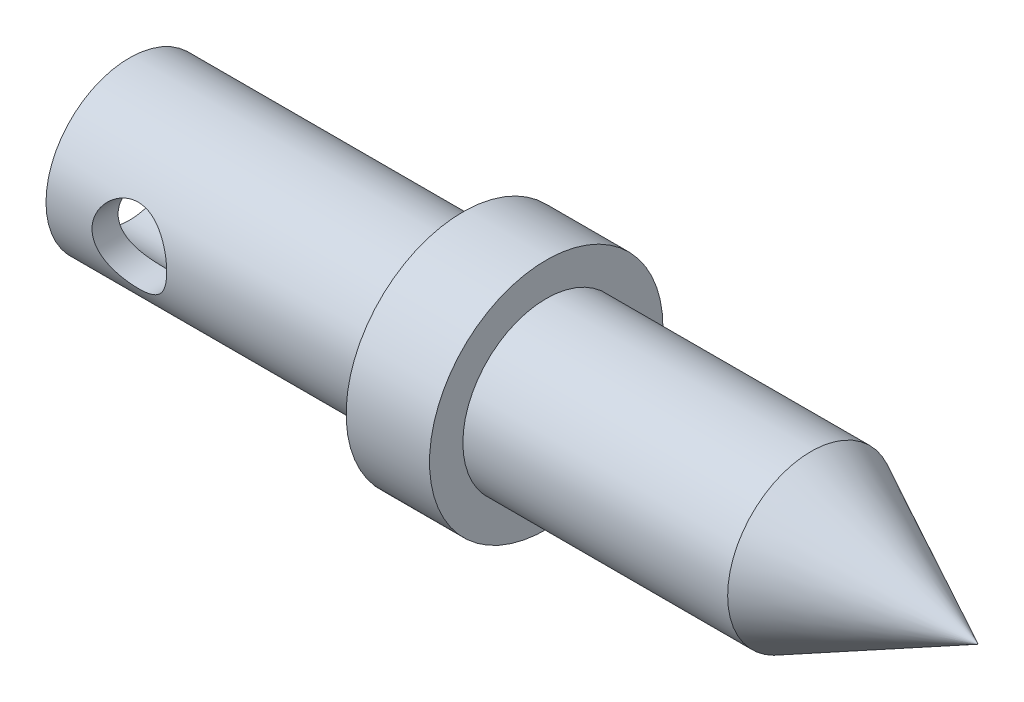
ISO-10303-21;
HEADER;
FILE_DESCRIPTION(('STEP AP214'),'2;1');
FILE_NAME('part.step','',(''),(''),'','','');
FILE_SCHEMA(('AUTOMOTIVE_DESIGN { 1 0 10303 214 1 1 1 1 }'));
ENDSEC;
DATA;
#1=APPLICATION_CONTEXT('core data for automotive mechanical design processes');
#2=APPLICATION_PROTOCOL_DEFINITION('international standard','automotive_design',2000,#1);
#3=PRODUCT_CONTEXT('',#1,'mechanical');
#4=PRODUCT('Part','Part','',(#3));
#5=PRODUCT_RELATED_PRODUCT_CATEGORY('part','',(#4));
#6=PRODUCT_DEFINITION_FORMATION('','',#4);
#7=PRODUCT_DEFINITION_CONTEXT('part definition',#1,'design');
#8=PRODUCT_DEFINITION('design','',#6,#7);
#9=PRODUCT_DEFINITION_SHAPE('','',#8);
#10=(LENGTH_UNIT() NAMED_UNIT(*) SI_UNIT(.MILLI.,.METRE.));
#11=(NAMED_UNIT(*) PLANE_ANGLE_UNIT() SI_UNIT($,.RADIAN.));
#12=(NAMED_UNIT(*) SI_UNIT($,.STERADIAN.) SOLID_ANGLE_UNIT());
#13=UNCERTAINTY_MEASURE_WITH_UNIT(LENGTH_MEASURE(1.E-05),#10,'distance_accuracy_value','');
#14=(GEOMETRIC_REPRESENTATION_CONTEXT(3) GLOBAL_UNCERTAINTY_ASSIGNED_CONTEXT((#13)) GLOBAL_UNIT_ASSIGNED_CONTEXT((#10,
#11,#12)) REPRESENTATION_CONTEXT('',''));
#15=CARTESIAN_POINT('',(0.,0.,0.));
#16=DIRECTION('',(0.,0.,1.));
#17=DIRECTION('',(1.,0.,0.));
#18=AXIS2_PLACEMENT_3D('',#15,#16,#17);
#19=CARTESIAN_POINT('',(-12.7,0.,0.));
#20=DIRECTION('',(1.,0.,0.));
#21=DIRECTION('',(0.,0.,-1.));
#22=AXIS2_PLACEMENT_3D('',#19,#20,#21);
#23=CYLINDRICAL_SURFACE('',#22,3.175);
#24=CARTESIAN_POINT('',(-12.7,0.,0.));
#25=DIRECTION('',(-1.,0.,0.));
#26=DIRECTION('',(0.,0.,1.));
#27=AXIS2_PLACEMENT_3D('',#24,#25,#26);
#28=CIRCLE('',#27,3.175);
#29=CARTESIAN_POINT('',(-12.7,0.,3.175));
#30=VERTEX_POINT('',#29);
#31=EDGE_CURVE('E118',#30,#30,#28,.T.);
#32=ORIENTED_EDGE('',*,*,#31,.F.);
#33=EDGE_LOOP('',(#32));
#34=FACE_BOUND('',#33,.T.);
#35=CARTESIAN_POINT('',(0.,0.,0.));
#36=DIRECTION('',(-1.,0.,0.));
#37=DIRECTION('',(0.,0.,1.));
#38=AXIS2_PLACEMENT_3D('',#35,#36,#37);
#39=CIRCLE('',#38,3.175);
#40=CARTESIAN_POINT('',(0.,0.,3.175));
#41=VERTEX_POINT('',#40);
#42=EDGE_CURVE('E47',#41,#41,#39,.T.);
#43=ORIENTED_EDGE('',*,*,#42,.T.);
#44=EDGE_LOOP('',(#43));
#45=FACE_BOUND('',#44,.T.);
#46=CARTESIAN_POINT('',(-10.9474,0.,3.175));
#47=CARTESIAN_POINT('',(-10.9473963570052,0.0756779264612847,3.17499700537828));
#48=CARTESIAN_POINT('',(-10.9413248337193,0.151472469629567,3.1722640929758));
#49=CARTESIAN_POINT('',(-10.9172809907349,0.300877459493572,3.16160357680319));
#50=CARTESIAN_POINT('',(-10.8992804169438,0.374482286299237,3.15366364060379));
#51=CARTESIAN_POINT('',(-10.8521912902194,0.517110523957208,3.13343126285695));
#52=CARTESIAN_POINT('',(-10.8231425424671,0.586149349369813,3.12115445767676));
#53=CARTESIAN_POINT('',(-10.7549611763161,0.718296366188488,3.09341884806947));
#54=CARTESIAN_POINT('',(-10.715830759152,0.781405848109427,3.07796073839736));
#55=CARTESIAN_POINT('',(-10.6262840432222,0.903560377141486,3.04440800187771));
#56=CARTESIAN_POINT('',(-10.5753908698923,0.962229545257989,3.02621867450654));
#57=CARTESIAN_POINT('',(-10.4647765516525,1.07053229024197,2.98962535005736));
#58=CARTESIAN_POINT('',(-10.4050500993329,1.12016039456472,2.97122123008912));
#59=CARTESIAN_POINT('',(-10.2742160029063,1.211877236786,2.93505583735024));
#60=CARTESIAN_POINT('',(-10.2026452295425,1.25334979523754,2.9173962635315));
#61=CARTESIAN_POINT('',(-10.0526463801713,1.32350083822352,2.88625265757965));
#62=CARTESIAN_POINT('',(-9.97422240083133,1.35218690445795,2.87276615249674));
#63=CARTESIAN_POINT('',(-9.81706083068597,1.39433931178323,2.85253686411667));
#64=CARTESIAN_POINT('',(-9.73856146592803,1.40853356777005,2.84547374055673));
#65=CARTESIAN_POINT('',(-9.58000239115375,1.42356115309051,2.83798818693886));
#66=CARTESIAN_POINT('',(-9.49994378683192,1.42440362819168,2.8375612112241));
#67=CARTESIAN_POINT('',(-9.34835649174536,1.41324598574481,2.84312951691521));
#68=CARTESIAN_POINT('',(-9.27671606519269,1.40241075206483,2.84854231649368));
#69=CARTESIAN_POINT('',(-9.13640452304333,1.37018219603638,2.86418280877391));
#70=CARTESIAN_POINT('',(-9.0677340928652,1.34878645051509,2.87441160651052));
#71=CARTESIAN_POINT('',(-8.93345607032829,1.29562042328715,2.89876883775956));
#72=CARTESIAN_POINT('',(-8.86795256245419,1.26362692528995,2.9129800616056));
#73=CARTESIAN_POINT('',(-8.74296439808899,1.19033457595395,2.94368903851684));
#74=CARTESIAN_POINT('',(-8.68348230879197,1.14903177966538,2.96018775979809));
#75=CARTESIAN_POINT('',(-8.5660168794717,1.05349737532474,2.99559829502278));
#76=CARTESIAN_POINT('',(-8.50876688916211,0.998389913052293,3.01458717295922));
#77=CARTESIAN_POINT('',(-8.40405315685163,0.879201332439006,3.05147836532997));
#78=CARTESIAN_POINT('',(-8.35659246764413,0.815117425223707,3.06938033958896));
#79=CARTESIAN_POINT('',(-8.27149150181106,0.677268375721417,3.10275775647093));
#80=CARTESIAN_POINT('',(-8.23419432850395,0.603267828544155,3.11814269416588));
#81=CARTESIAN_POINT('',(-8.17284362261133,0.449176308692247,3.14403435224135));
#82=CARTESIAN_POINT('',(-8.1487816056215,0.369089275333423,3.15454419712409));
#83=CARTESIAN_POINT('',(-8.11622256160105,0.211186518233031,3.16888947141875));
#84=CARTESIAN_POINT('',(-8.10674419306069,0.133611399260799,3.17314474794642));
#85=CARTESIAN_POINT('',(-8.100640874123,-0.0221332066175229,3.17587664262326));
#86=CARTESIAN_POINT('',(-8.10401146352675,-0.100302477876443,3.17435526599586));
#87=CARTESIAN_POINT('',(-8.12285020383754,-0.250122259019025,3.16596981850281));
#88=CARTESIAN_POINT('',(-8.13758980845343,-0.321884602089044,3.15942761359563));
#89=CARTESIAN_POINT('',(-8.17768887283828,-0.461815818715243,3.14202568319576));
#90=CARTESIAN_POINT('',(-8.20304961590522,-0.529984256917277,3.13116543598407));
#91=CARTESIAN_POINT('',(-8.26447345158172,-0.663206896778449,3.10572476839645));
#92=CARTESIAN_POINT('',(-8.30084531967642,-0.728097940245259,3.09103900076819));
#93=CARTESIAN_POINT('',(-8.38292251076715,-0.851089307777488,3.05946241305371));
#94=CARTESIAN_POINT('',(-8.42863191062324,-0.909186648162121,3.04257063096539));
#95=CARTESIAN_POINT('',(-8.53243792845099,-1.02195133320593,3.00666301846088));
#96=CARTESIAN_POINT('',(-8.59124176781799,-1.0759498889015,2.98758644178358));
#97=CARTESIAN_POINT('',(-8.71730127538655,-1.17354221138499,2.9506191206961));
#98=CARTESIAN_POINT('',(-8.78456008162974,-1.21713209751164,2.93272882035497));
#99=CARTESIAN_POINT('',(-8.92786368837336,-1.29360098054906,2.8998281463255));
#100=CARTESIAN_POINT('',(-9.00408514366298,-1.32618723309754,2.88490028726746));
#101=CARTESIAN_POINT('',(-9.16182136459902,-1.37774800421995,2.86064008788349));
#102=CARTESIAN_POINT('',(-9.24333075269127,-1.39673612189713,2.85130215876789));
#103=CARTESIAN_POINT('',(-9.40181130418259,-1.41911684499667,2.8402242994691));
#104=CARTESIAN_POINT('',(-9.47857292525921,-1.42370629654083,2.83790191548196));
#105=CARTESIAN_POINT('',(-9.63175539314065,-1.4204539548689,2.83953170048166));
#106=CARTESIAN_POINT('',(-9.70817631202577,-1.41261492973785,2.8434824723041));
#107=CARTESIAN_POINT('',(-9.85357360609678,-1.38578112634038,2.85664750427491));
#108=CARTESIAN_POINT('',(-9.92271760613347,-1.36750917841443,2.86551974780031));
#109=CARTESIAN_POINT('',(-10.0569463995941,-1.32109861714779,2.8872090064969));
#110=CARTESIAN_POINT('',(-10.1220300081886,-1.2929571395761,2.90002716667832));
#111=CARTESIAN_POINT('',(-10.2508906630455,-1.22553223953495,2.92918512286425));
#112=CARTESIAN_POINT('',(-10.3143127404411,-1.18564729022863,2.94569872444081));
#113=CARTESIAN_POINT('',(-10.4339350561064,-1.09664135612336,2.97997917208123));
#114=CARTESIAN_POINT('',(-10.4901321998782,-1.04751643581002,2.99774655013484));
#115=CARTESIAN_POINT('',(-10.5989052815985,-0.93623182075846,3.03443938207569));
#116=CARTESIAN_POINT('',(-10.6507074141752,-0.873299154861077,3.05332622848741));
#117=CARTESIAN_POINT('',(-10.7431032888475,-0.738978248416241,3.08858402592099));
#118=CARTESIAN_POINT('',(-10.7836918896988,-0.66758615070313,3.10495382139068));
#119=CARTESIAN_POINT('',(-10.8518563115134,-0.518933230645142,3.13320876014289));
#120=CARTESIAN_POINT('',(-10.8795638783947,-0.441741650534364,3.1451390467364));
#121=CARTESIAN_POINT('',(-10.9213051085478,-0.283245969085183,3.16333883577198));
#122=CARTESIAN_POINT('',(-10.9353803295752,-0.201955166383236,3.16962553818067));
#123=CARTESIAN_POINT('',(-10.944014289794,-0.100124563806049,3.17348471855721));
#124=CARTESIAN_POINT('',(-10.9452827181506,-0.0801273199862786,3.17405194992806));
#125=CARTESIAN_POINT('',(-10.946976061265,-0.0400894460306459,3.17480998975574));
#126=CARTESIAN_POINT('',(-10.9474009651127,-0.0200488153369736,3.17500079334386));
#127=CARTESIAN_POINT('',(-10.9474,0.,3.175));
#128=B_SPLINE_CURVE_WITH_KNOTS('',3,(#46,#47,#48,#49,#50,#51,#52,#53,#54,#55,#56,#57,#58,#59,
#60,#61,#62,#63,#64,#65,#66,#67,#68,#69,#70,#71,#72,#73,#74,#75,#76,#77,#78,#79,#80,#81,#82,#83,
#84,#85,#86,#87,#88,#89,#90,#91,#92,#93,#94,#95,#96,#97,#98,#99,#100,#101,#102,#103,#104,#105,
#106,#107,#108,#109,#110,#111,#112,#113,#114,#115,#116,#117,#118,#119,#120,#121,#122,#123,#124,
#125,#126,#127),.UNSPECIFIED.,.T.,.F.,(4,2,2,2,2,2,2,2,2,2,2,2,2,2,2,2,2,2,2,2,2,2,2,2,2,2,2,2,
2,2,2,2,2,2,2,2,2,2,2,2,4),(0.,0.22695144344719,0.454442354381849,0.681121291506364,
0.907750777369157,1.14603405064644,1.38446108071065,1.63693040208673,1.88924982298657,
2.12815800187746,2.36690252520834,2.58386138104225,2.80087004254674,3.02277571555002,
3.24477560168292,3.48878672324842,3.73287382501105,3.9843946480522,4.23575404505446,
4.46931813848689,4.70280116328764,4.9224515686375,5.14212852088539,5.36864854014991,
5.59526767252509,5.84041499870255,6.08565358087876,6.33697988581587,6.58805449421646,
6.81761671304215,7.04712781068054,7.26238953178569,7.47771377564615,7.70692491324627,
7.9362338990787,8.18605856709384,8.43599758678672,8.6833207421618,8.92988754556653,
8.99001140126522,9.05013603460147),.UNSPECIFIED.);
#129=CARTESIAN_POINT('',(-10.9474,0.,3.175));
#130=VERTEX_POINT('',#129);
#131=EDGE_CURVE('E54',#130,#130,#128,.T.);
#132=ORIENTED_EDGE('',*,*,#131,.T.);
#133=EDGE_LOOP('',(#132));
#134=FACE_BOUND('',#133,.T.);
#135=CARTESIAN_POINT('',(-10.9474,0.,-3.175));
#136=CARTESIAN_POINT('',(-10.9473963570052,0.0756779264612847,-3.17499700537828));
#137=CARTESIAN_POINT('',(-10.9413248337193,0.151472469629567,-3.1722640929758));
#138=CARTESIAN_POINT('',(-10.9172809907349,0.300877459493572,-3.16160357680319));
#139=CARTESIAN_POINT('',(-10.8992804169438,0.374482286299237,-3.15366364060379));
#140=CARTESIAN_POINT('',(-10.8521912902194,0.517110523957208,-3.13343126285695));
#141=CARTESIAN_POINT('',(-10.8231425424671,0.586149349369813,-3.12115445767676));
#142=CARTESIAN_POINT('',(-10.7549611763161,0.718296366188488,-3.09341884806947));
#143=CARTESIAN_POINT('',(-10.715830759152,0.781405848109427,-3.07796073839736));
#144=CARTESIAN_POINT('',(-10.6262840432222,0.903560377141486,-3.04440800187771));
#145=CARTESIAN_POINT('',(-10.5753908698923,0.962229545257989,-3.02621867450654));
#146=CARTESIAN_POINT('',(-10.4647765516525,1.07053229024197,-2.98962535005736));
#147=CARTESIAN_POINT('',(-10.4050500993329,1.12016039456472,-2.97122123008912));
#148=CARTESIAN_POINT('',(-10.2742160029063,1.211877236786,-2.93505583735024));
#149=CARTESIAN_POINT('',(-10.2026452295425,1.25334979523754,-2.9173962635315));
#150=CARTESIAN_POINT('',(-10.0526463801713,1.32350083822352,-2.88625265757965));
#151=CARTESIAN_POINT('',(-9.97422240083133,1.35218690445795,-2.87276615249674));
#152=CARTESIAN_POINT('',(-9.81706083068597,1.39433931178323,-2.85253686411667));
#153=CARTESIAN_POINT('',(-9.73856146592803,1.40853356777005,-2.84547374055673));
#154=CARTESIAN_POINT('',(-9.58000239115375,1.42356115309051,-2.83798818693886));
#155=CARTESIAN_POINT('',(-9.49994378683192,1.42440362819168,-2.8375612112241));
#156=CARTESIAN_POINT('',(-9.34835649174536,1.41324598574481,-2.84312951691521));
#157=CARTESIAN_POINT('',(-9.27671606519269,1.40241075206483,-2.84854231649368));
#158=CARTESIAN_POINT('',(-9.13640452304333,1.37018219603638,-2.86418280877391));
#159=CARTESIAN_POINT('',(-9.0677340928652,1.34878645051509,-2.87441160651052));
#160=CARTESIAN_POINT('',(-8.93345607032829,1.29562042328715,-2.89876883775956));
#161=CARTESIAN_POINT('',(-8.86795256245419,1.26362692528995,-2.9129800616056));
#162=CARTESIAN_POINT('',(-8.74296439808899,1.19033457595395,-2.94368903851684));
#163=CARTESIAN_POINT('',(-8.68348230879197,1.14903177966538,-2.96018775979809));
#164=CARTESIAN_POINT('',(-8.5660168794717,1.05349737532474,-2.99559829502278));
#165=CARTESIAN_POINT('',(-8.50876688916211,0.998389913052293,-3.01458717295922));
#166=CARTESIAN_POINT('',(-8.40405315685163,0.879201332439006,-3.05147836532997));
#167=CARTESIAN_POINT('',(-8.35659246764413,0.815117425223707,-3.06938033958896));
#168=CARTESIAN_POINT('',(-8.27149150181106,0.677268375721417,-3.10275775647093));
#169=CARTESIAN_POINT('',(-8.23419432850395,0.603267828544155,-3.11814269416588));
#170=CARTESIAN_POINT('',(-8.17284362261133,0.449176308692247,-3.14403435224135));
#171=CARTESIAN_POINT('',(-8.1487816056215,0.369089275333423,-3.15454419712409));
#172=CARTESIAN_POINT('',(-8.11622256160105,0.211186518233031,-3.16888947141875));
#173=CARTESIAN_POINT('',(-8.10674419306069,0.133611399260799,-3.17314474794642));
#174=CARTESIAN_POINT('',(-8.100640874123,-0.0221332066175229,-3.17587664262326));
#175=CARTESIAN_POINT('',(-8.10401146352675,-0.100302477876443,-3.17435526599586));
#176=CARTESIAN_POINT('',(-8.12285020383754,-0.250122259019025,-3.16596981850281));
#177=CARTESIAN_POINT('',(-8.13758980845343,-0.321884602089044,-3.15942761359563));
#178=CARTESIAN_POINT('',(-8.17768887283828,-0.461815818715243,-3.14202568319576));
#179=CARTESIAN_POINT('',(-8.20304961590522,-0.529984256917277,-3.13116543598407));
#180=CARTESIAN_POINT('',(-8.26447345158172,-0.663206896778449,-3.10572476839645));
#181=CARTESIAN_POINT('',(-8.30084531967642,-0.728097940245259,-3.09103900076819));
#182=CARTESIAN_POINT('',(-8.38292251076715,-0.851089307777488,-3.05946241305371));
#183=CARTESIAN_POINT('',(-8.42863191062324,-0.909186648162121,-3.04257063096539));
#184=CARTESIAN_POINT('',(-8.53243792845099,-1.02195133320593,-3.00666301846088));
#185=CARTESIAN_POINT('',(-8.59124176781799,-1.0759498889015,-2.98758644178358));
#186=CARTESIAN_POINT('',(-8.71730127538655,-1.17354221138499,-2.9506191206961));
#187=CARTESIAN_POINT('',(-8.78456008162974,-1.21713209751164,-2.93272882035497));
#188=CARTESIAN_POINT('',(-8.92786368837336,-1.29360098054906,-2.8998281463255));
#189=CARTESIAN_POINT('',(-9.00408514366298,-1.32618723309754,-2.88490028726746));
#190=CARTESIAN_POINT('',(-9.16182136459902,-1.37774800421995,-2.86064008788349));
#191=CARTESIAN_POINT('',(-9.24333075269127,-1.39673612189713,-2.85130215876789));
#192=CARTESIAN_POINT('',(-9.40181130418259,-1.41911684499667,-2.8402242994691));
#193=CARTESIAN_POINT('',(-9.47857292525921,-1.42370629654083,-2.83790191548196));
#194=CARTESIAN_POINT('',(-9.63175539314065,-1.4204539548689,-2.83953170048166));
#195=CARTESIAN_POINT('',(-9.70817631202577,-1.41261492973785,-2.8434824723041));
#196=CARTESIAN_POINT('',(-9.85357360609678,-1.38578112634038,-2.85664750427491));
#197=CARTESIAN_POINT('',(-9.92271760613347,-1.36750917841443,-2.86551974780031));
#198=CARTESIAN_POINT('',(-10.0569463995941,-1.32109861714779,-2.8872090064969));
#199=CARTESIAN_POINT('',(-10.1220300081886,-1.2929571395761,-2.90002716667832));
#200=CARTESIAN_POINT('',(-10.2508906630455,-1.22553223953495,-2.92918512286425));
#201=CARTESIAN_POINT('',(-10.3143127404411,-1.18564729022863,-2.94569872444081));
#202=CARTESIAN_POINT('',(-10.4339350561064,-1.09664135612336,-2.97997917208123));
#203=CARTESIAN_POINT('',(-10.4901321998782,-1.04751643581002,-2.99774655013484));
#204=CARTESIAN_POINT('',(-10.5989052815985,-0.93623182075846,-3.03443938207569));
#205=CARTESIAN_POINT('',(-10.6507074141752,-0.873299154861077,-3.05332622848741));
#206=CARTESIAN_POINT('',(-10.7431032888475,-0.738978248416241,-3.08858402592099));
#207=CARTESIAN_POINT('',(-10.7836918896988,-0.66758615070313,-3.10495382139068));
#208=CARTESIAN_POINT('',(-10.8518563115134,-0.518933230645142,-3.13320876014289));
#209=CARTESIAN_POINT('',(-10.8795638783947,-0.441741650534364,-3.1451390467364));
#210=CARTESIAN_POINT('',(-10.9213051085478,-0.283245969085183,-3.16333883577198));
#211=CARTESIAN_POINT('',(-10.9353803295752,-0.201955166383236,-3.16962553818067));
#212=CARTESIAN_POINT('',(-10.944014289794,-0.100124563806049,-3.17348471855721));
#213=CARTESIAN_POINT('',(-10.9452827181506,-0.0801273199862786,-3.17405194992806));
#214=CARTESIAN_POINT('',(-10.946976061265,-0.0400894460306459,-3.17480998975574));
#215=CARTESIAN_POINT('',(-10.9474009651127,-0.0200488153369736,-3.17500079334386));
#216=CARTESIAN_POINT('',(-10.9474,0.,-3.175));
#217=B_SPLINE_CURVE_WITH_KNOTS('',3,(#135,#136,#137,#138,#139,#140,#141,#142,#143,#144,#145,
#146,#147,#148,#149,#150,#151,#152,#153,#154,#155,#156,#157,#158,#159,#160,#161,#162,#163,#164,
#165,#166,#167,#168,#169,#170,#171,#172,#173,#174,#175,#176,#177,#178,#179,#180,#181,#182,#183,
#184,#185,#186,#187,#188,#189,#190,#191,#192,#193,#194,#195,#196,#197,#198,#199,#200,#201,#202,
#203,#204,#205,#206,#207,#208,#209,#210,#211,#212,#213,#214,#215,#216),.UNSPECIFIED.,.T.,.F.,(4,
2,2,2,2,2,2,2,2,2,2,2,2,2,2,2,2,2,2,2,2,2,2,2,2,2,2,2,2,2,2,2,2,2,2,2,2,2,2,2,4),(0.,
0.22695144344719,0.454442354381849,0.681121291506364,0.907750777369157,1.14603405064644,
1.38446108071065,1.63693040208673,1.88924982298657,2.12815800187746,2.36690252520834,
2.58386138104225,2.80087004254674,3.02277571555002,3.24477560168292,3.48878672324842,
3.73287382501105,3.9843946480522,4.23575404505446,4.46931813848689,4.70280116328764,
4.9224515686375,5.14212852088539,5.36864854014991,5.59526767252509,5.84041499870255,
6.08565358087876,6.33697988581587,6.58805449421646,6.81761671304215,7.04712781068054,
7.26238953178569,7.47771377564615,7.70692491324627,7.9362338990787,8.18605856709384,
8.43599758678672,8.6833207421618,8.92988754556653,8.99001140126522,9.05013603460147),.UNSPECIFIED.);
#218=CARTESIAN_POINT('',(-10.9474,0.,-3.175));
#219=VERTEX_POINT('',#218);
#220=EDGE_CURVE('E75',#219,#219,#217,.T.);
#221=ORIENTED_EDGE('',*,*,#220,.F.);
#222=EDGE_LOOP('',(#221));
#223=FACE_BOUND('',#222,.T.);
#224=ADVANCED_FACE('F30',(#34,#45,#134,#223),#23,.T.);
#225=CARTESIAN_POINT('',(-6.35,0.,0.));
#226=DIRECTION('',(-1.,0.,0.));
#227=DIRECTION('',(0.,0.,1.));
#228=AXIS2_PLACEMENT_3D('',#225,#226,#227);
#229=CYLINDRICAL_SURFACE('',#228,2.1828125);
#230=CARTESIAN_POINT('',(-6.35,0.,0.));
#231=DIRECTION('',(-1.,0.,0.));
#232=DIRECTION('',(0.,0.,1.));
#233=AXIS2_PLACEMENT_3D('',#230,#231,#232);
#234=CIRCLE('',#233,2.1828125);
#235=CARTESIAN_POINT('',(-6.35,0.,2.1828125));
#236=VERTEX_POINT('',#235);
#237=EDGE_CURVE('E122',#236,#236,#234,.T.);
#238=ORIENTED_EDGE('',*,*,#237,.F.);
#239=EDGE_LOOP('',(#238));
#240=FACE_BOUND('',#239,.T.);
#241=CARTESIAN_POINT('',(-12.7,0.,0.));
#242=DIRECTION('',(-1.,0.,0.));
#243=DIRECTION('',(0.,0.,1.));
#244=AXIS2_PLACEMENT_3D('',#241,#242,#243);
#245=CIRCLE('',#244,2.1828125);
#246=CARTESIAN_POINT('',(-12.7,0.,2.1828125));
#247=VERTEX_POINT('',#246);
#248=EDGE_CURVE('E129',#247,#247,#245,.T.);
#249=ORIENTED_EDGE('',*,*,#248,.T.);
#250=EDGE_LOOP('',(#249));
#251=FACE_BOUND('',#250,.T.);
#252=CARTESIAN_POINT('',(-10.9474,0.,-2.1828125));
#253=CARTESIAN_POINT('',(-10.9473974295443,-0.0717692520370295,-2.1828100380997));
#254=CARTESIAN_POINT('',(-10.9419363765719,-0.143562476901109,-2.17924026584394));
#255=CARTESIAN_POINT('',(-10.9204155113276,-0.284881118672217,-2.16531008447702));
#256=CARTESIAN_POINT('',(-10.9043471135399,-0.354404650627367,-2.15494417466286));
#257=CARTESIAN_POINT('',(-10.8625792529804,-0.488921047447853,-2.12845207929401));
#258=CARTESIAN_POINT('',(-10.8369252096931,-0.553933590787987,-2.11235307537335));
#259=CARTESIAN_POINT('',(-10.7770615301844,-0.678486402122695,-2.07570406404613));
#260=CARTESIAN_POINT('',(-10.742850994733,-0.738026094057352,-2.05515358885022));
#261=CARTESIAN_POINT('',(-10.6637351481692,-0.855530039218158,-2.00923882679634));
#262=CARTESIAN_POINT('',(-10.6181772009073,-0.912951883630717,-1.98361638531258));
#263=CARTESIAN_POINT('',(-10.5191970516837,-1.01985845094637,-1.9308345181437));
#264=CARTESIAN_POINT('',(-10.4657638949163,-1.06933191359371,-1.90367298443475));
#265=CARTESIAN_POINT('',(-10.3432382603959,-1.16649428143675,-1.84596999393243));
#266=CARTESIAN_POINT('',(-10.2729989913821,-1.21280896446511,-1.81553078823266));
#267=CARTESIAN_POINT('',(-10.1239853154546,-1.29288862427204,-1.75940434614281));
#268=CARTESIAN_POINT('',(-10.0452259450739,-1.32667525884531,-1.73370894791199));
#269=CARTESIAN_POINT('',(-9.90355718380134,-1.3725201171048,-1.69748773260368));
#270=CARTESIAN_POINT('',(-9.84233331192554,-1.3880081953617,-1.68473045882713));
#271=CARTESIAN_POINT('',(-9.71742724034937,-1.41074711007776,-1.66573971113385));
#272=CARTESIAN_POINT('',(-9.65374916287432,-1.41801118567355,-1.65949575325043));
#273=CARTESIAN_POINT('',(-9.52546432436379,-1.42385280678684,-1.65448836138431));
#274=CARTESIAN_POINT('',(-9.46085509844645,-1.42239995899405,-1.65575110087428));
#275=CARTESIAN_POINT('',(-9.33296454355627,-1.41084176641562,-1.66560750023578));
#276=CARTESIAN_POINT('',(-9.2696843734244,-1.40072916769062,-1.67420730606247));
#277=CARTESIAN_POINT('',(-9.14836680599574,-1.37299257767056,-1.69701655095648));
#278=CARTESIAN_POINT('',(-9.09022287867419,-1.3556497792094,-1.71101465409372));
#279=CARTESIAN_POINT('',(-8.97759471932813,-1.31422002522236,-1.74303758589323));
#280=CARTESIAN_POINT('',(-8.92311169838015,-1.29013085139285,-1.76106373864045));
#281=CARTESIAN_POINT('',(-8.80786664929122,-1.23042588051804,-1.80341623335185));
#282=CARTESIAN_POINT('',(-8.74799780237698,-1.19347214271501,-1.82828328959453));
#283=CARTESIAN_POINT('',(-8.63462134040527,-1.11146345960496,-1.87927028852718));
#284=CARTESIAN_POINT('',(-8.58112155970127,-1.06639870485766,-1.90539171989418));
#285=CARTESIAN_POINT('',(-8.47125050947043,-0.959078487431435,-1.96193813724861));
#286=CARTESIAN_POINT('',(-8.41637808453538,-0.895185027147271,-1.99220103618276));
#287=CARTESIAN_POINT('',(-8.31811258770884,-0.757480587331175,-2.04851400416963));
#288=CARTESIAN_POINT('',(-8.27470782099787,-0.683679828126014,-2.07456835451423));
#289=CARTESIAN_POINT('',(-8.20857291315962,-0.543157570807856,-2.11515803305466));
#290=CARTESIAN_POINT('',(-8.1834510513706,-0.477926301285113,-2.13095261884055));
#291=CARTESIAN_POINT('',(-8.14289952201753,-0.343426763539553,-2.15671117436835));
#292=CARTESIAN_POINT('',(-8.12746186343563,-0.274161875416492,-2.16667995086965));
#293=CARTESIAN_POINT('',(-8.10705380689087,-0.133189426074233,-2.17989877325059));
#294=CARTESIAN_POINT('',(-8.10212273366555,-0.0614737051557692,-2.18312357651485));
#295=CARTESIAN_POINT('',(-8.10315024114579,0.0818499692751757,-2.18245387079499));
#296=CARTESIAN_POINT('',(-8.10910892014335,0.15345792180909,-2.17855929755066));
#297=CARTESIAN_POINT('',(-8.13086520273735,0.290004961218909,-2.1644856563707));
#298=CARTESIAN_POINT('',(-8.1460468687975,0.355085623768363,-2.15470033405535));
#299=CARTESIAN_POINT('',(-8.18497021436317,0.48158572096176,-2.13000067102112));
#300=CARTESIAN_POINT('',(-8.20871327936393,0.543004561135412,-2.11508550015447));
#301=CARTESIAN_POINT('',(-8.2657632416637,0.66512881387197,-2.08004422758935));
#302=CARTESIAN_POINT('',(-8.29961539762379,0.725494924428743,-2.05963038780092));
#303=CARTESIAN_POINT('',(-8.37503422622907,0.83994355717666,-2.01567132009163));
#304=CARTESIAN_POINT('',(-8.41660639160372,0.89402156059721,-1.99212386602914));
#305=CARTESIAN_POINT('',(-8.51361813582502,1.00322671715017,-1.93969581119775));
#306=CARTESIAN_POINT('',(-8.57020897158569,1.05720771347519,-1.91055550164618));
#307=CARTESIAN_POINT('',(-8.69165719452866,1.15536193156736,-1.85284950003957));
#308=CARTESIAN_POINT('',(-8.756518164393,1.19953087980744,-1.82428406327035));
#309=CARTESIAN_POINT('',(-8.8858098814544,1.27259999330263,-1.77394884002758));
#310=CARTESIAN_POINT('',(-8.94941389617859,1.30267832452877,-1.75177509209395));
#311=CARTESIAN_POINT('',(-9.08180034703466,1.35343964872393,-1.71286326279226));
#312=CARTESIAN_POINT('',(-9.1505731821722,1.37413958250085,-1.69611539602761));
#313=CARTESIAN_POINT('',(-9.28105470571106,1.40266192812429,-1.67257323187502));
#314=CARTESIAN_POINT('',(-9.34222829922158,1.41197283741786,-1.66464602217927));
#315=CARTESIAN_POINT('',(-9.46575171907034,1.42251360284225,-1.65565038822651));
#316=CARTESIAN_POINT('',(-9.52810056116251,1.42374994386399,-1.65457645994095));
#317=CARTESIAN_POINT('',(-9.65209401989004,1.41806926391707,-1.65944605572049));
#318=CARTESIAN_POINT('',(-9.71373904737883,1.41115727416563,-1.66538524951096));
#319=CARTESIAN_POINT('',(-9.83476694820498,1.3896245520332,-1.68339106252904));
#320=CARTESIAN_POINT('',(-9.89414679038416,1.37499385385793,-1.69546560249246));
#321=CARTESIAN_POINT('',(-10.0262769522325,1.33342984103006,-1.72844521487612));
#322=CARTESIAN_POINT('',(-10.0978999551698,1.30415723966433,-1.75089661451329));
#323=CARTESIAN_POINT('',(-10.2343468962188,1.23527775747726,-1.80015274314515));
#324=CARTESIAN_POINT('',(-10.2991613418301,1.19565671009198,-1.82696342065732));
#325=CARTESIAN_POINT('',(-10.4222948846733,1.10632557111637,-1.88242465915265));
#326=CARTESIAN_POINT('',(-10.4804952117679,1.05646600153221,-1.91109759301869));
#327=CARTESIAN_POINT('',(-10.5884463416022,0.947720128477974,-1.96729377423871));
#328=CARTESIAN_POINT('',(-10.6381950383381,0.888831582073624,-1.99481673375391));
#329=CARTESIAN_POINT('',(-10.7328306487528,0.756097512466841,-2.0490601270892));
#330=CARTESIAN_POINT('',(-10.7766649735405,0.681331843787229,-2.07539559621183));
#331=CARTESIAN_POINT('',(-10.8505050987616,0.523276654254309,-2.12074551140077));
#332=CARTESIAN_POINT('',(-10.8805412092041,0.440006312290492,-2.13977598878461));
#333=CARTESIAN_POINT('',(-10.9173819537545,0.296658219031911,-2.16334347226264));
#334=CARTESIAN_POINT('',(-10.9285958446835,0.238130142112568,-2.17059870041834));
#335=CARTESIAN_POINT('',(-10.9436047190599,0.119739975386419,-2.18033345528749));
#336=CARTESIAN_POINT('',(-10.9474021445758,0.0598783312608948,-2.18281455400611));
#337=CARTESIAN_POINT('',(-10.9474,0.,-2.1828125));
#338=B_SPLINE_CURVE_WITH_KNOTS('',3,(#252,#253,#254,#255,#256,#257,#258,#259,#260,#261,#262,
#263,#264,#265,#266,#267,#268,#269,#270,#271,#272,#273,#274,#275,#276,#277,#278,#279,#280,#281,
#282,#283,#284,#285,#286,#287,#288,#289,#290,#291,#292,#293,#294,#295,#296,#297,#298,#299,#300,
#301,#302,#303,#304,#305,#306,#307,#308,#309,#310,#311,#312,#313,#314,#315,#316,#317,#318,#319,
#320,#321,#322,#323,#324,#325,#326,#327,#328,#329,#330,#331,#332,#333,#334,#335,#336,#337),
.UNSPECIFIED.,.T.,.F.,(4,2,2,2,2,2,2,2,2,2,2,2,2,2,2,2,2,2,2,2,2,2,2,2,2,2,2,2,2,2,2,2,2,2,2,2,
2,2,2,2,2,2,4),(0.,0.215064576703185,0.430303439055015,0.644535111952849,0.858789308630259,
1.09085422856251,1.32324506353269,1.59040196478626,1.85709484266169,2.04959964558451,
2.24179410844437,2.43465908456011,2.62768577443792,2.81381794853726,3.00001139753076,
3.22307689782427,3.4464140081218,3.71360418652251,3.98052082094775,4.19460438903524,
4.40851107073443,4.62321698011313,4.83792482745842,5.03966577930691,5.24143939365228,
5.45708392767296,5.67288248314953,5.92226069548048,6.17174730966109,6.39222751770637,
6.61230785443117,6.7986215506907,6.98478559526725,7.17083475234036,7.35712471157339,
7.59753508413846,7.83827630872455,8.08282021202109,8.32742496243903,8.59761117133197,
8.86720100066889,9.04669221788563,9.22612432287222),.UNSPECIFIED.);
#339=CARTESIAN_POINT('',(-10.9474,0.,-2.1828125));
#340=VERTEX_POINT('',#339);
#341=EDGE_CURVE('E50',#340,#340,#338,.T.);
#342=ORIENTED_EDGE('',*,*,#341,.F.);
#343=EDGE_LOOP('',(#342));
#344=FACE_BOUND('',#343,.T.);
#345=CARTESIAN_POINT('',(-8.1026,0.,2.1828125));
#346=CARTESIAN_POINT('',(-8.10260257045571,-0.0717692520370295,2.1828100380997));
#347=CARTESIAN_POINT('',(-8.10806362342812,-0.143562476901109,2.17924026584394));
#348=CARTESIAN_POINT('',(-8.12958448867242,-0.284881118672217,2.16531008447702));
#349=CARTESIAN_POINT('',(-8.14565288646014,-0.354404650627367,2.15494417466286));
#350=CARTESIAN_POINT('',(-8.18742074701963,-0.488921047447852,2.12845207929401));
#351=CARTESIAN_POINT('',(-8.21307479030689,-0.553933590787986,2.11235307537335));
#352=CARTESIAN_POINT('',(-8.2729384698156,-0.678486402122694,2.07570406404613));
#353=CARTESIAN_POINT('',(-8.30714900526702,-0.738026094057352,2.05515358885022));
#354=CARTESIAN_POINT('',(-8.38626485183077,-0.855530039218158,2.00923882679634));
#355=CARTESIAN_POINT('',(-8.43182279909268,-0.912951883630718,1.98361638531258));
#356=CARTESIAN_POINT('',(-8.53080294831628,-1.01985845094637,1.9308345181437));
#357=CARTESIAN_POINT('',(-8.5842361050837,-1.06933191359371,1.90367298443475));
#358=CARTESIAN_POINT('',(-8.70676173960409,-1.16649428143675,1.84596999393243));
#359=CARTESIAN_POINT('',(-8.77700100861795,-1.21280896446511,1.81553078823266));
#360=CARTESIAN_POINT('',(-8.92601468454538,-1.29288862427204,1.75940434614281));
#361=CARTESIAN_POINT('',(-9.00477405492605,-1.32667525884531,1.73370894791199));
#362=CARTESIAN_POINT('',(-9.14644281619866,-1.3725201171048,1.69748773260368));
#363=CARTESIAN_POINT('',(-9.20766668807446,-1.3880081953617,1.68473045882713));
#364=CARTESIAN_POINT('',(-9.33257275965062,-1.41074711007776,1.66573971113385));
#365=CARTESIAN_POINT('',(-9.39625083712568,-1.41801118567355,1.65949575325043));
#366=CARTESIAN_POINT('',(-9.52453567563621,-1.42385280678684,1.65448836138431));
#367=CARTESIAN_POINT('',(-9.58914490155354,-1.42239995899405,1.65575110087428));
#368=CARTESIAN_POINT('',(-9.71703545644372,-1.41084176641562,1.66560750023578));
#369=CARTESIAN_POINT('',(-9.7803156265756,-1.40072916769062,1.67420730606247));
#370=CARTESIAN_POINT('',(-9.90163319400425,-1.37299257767056,1.69701655095648));
#371=CARTESIAN_POINT('',(-9.95977712132581,-1.3556497792094,1.71101465409372));
#372=CARTESIAN_POINT('',(-10.0724052806719,-1.31422002522236,1.74303758589323));
#373=CARTESIAN_POINT('',(-10.1268883016199,-1.29013085139285,1.76106373864045));
#374=CARTESIAN_POINT('',(-10.2421333507088,-1.23042588051804,1.80341623335185));
#375=CARTESIAN_POINT('',(-10.302002197623,-1.19347214271502,1.82828328959453));
#376=CARTESIAN_POINT('',(-10.4153786595947,-1.11146345960496,1.87927028852718));
#377=CARTESIAN_POINT('',(-10.4688784402987,-1.06639870485766,1.90539171989418));
#378=CARTESIAN_POINT('',(-10.5787494905296,-0.959078487431435,1.96193813724861));
#379=CARTESIAN_POINT('',(-10.6336219154646,-0.895185027147271,1.99220103618276));
#380=CARTESIAN_POINT('',(-10.7318874122912,-0.757480587331175,2.04851400416963));
#381=CARTESIAN_POINT('',(-10.7752921790021,-0.683679828126014,2.07456835451423));
#382=CARTESIAN_POINT('',(-10.8414270868404,-0.543157570807856,2.11515803305466));
#383=CARTESIAN_POINT('',(-10.8665489486294,-0.477926301285113,2.13095261884055));
#384=CARTESIAN_POINT('',(-10.9071004779825,-0.343426763539553,2.15671117436835));
#385=CARTESIAN_POINT('',(-10.9225381365644,-0.274161875416492,2.16667995086965));
#386=CARTESIAN_POINT('',(-10.9429461931091,-0.133189426074233,2.17989877325059));
#387=CARTESIAN_POINT('',(-10.9478772663344,-0.0614737051557692,2.18312357651485));
#388=CARTESIAN_POINT('',(-10.9468497588542,0.0818499692751757,2.18245387079499));
#389=CARTESIAN_POINT('',(-10.9408910798566,0.15345792180909,2.17855929755066));
#390=CARTESIAN_POINT('',(-10.9191347972626,0.290004961218909,2.1644856563707));
#391=CARTESIAN_POINT('',(-10.9039531312025,0.355085623768363,2.15470033405535));
#392=CARTESIAN_POINT('',(-10.8650297856368,0.48158572096176,2.13000067102112));
#393=CARTESIAN_POINT('',(-10.8412867206361,0.543004561135412,2.11508550015447));
#394=CARTESIAN_POINT('',(-10.7842367583363,0.66512881387197,2.08004422758935));
#395=CARTESIAN_POINT('',(-10.7503846023762,0.725494924428743,2.05963038780092));
#396=CARTESIAN_POINT('',(-10.6749657737709,0.83994355717666,2.01567132009163));
#397=CARTESIAN_POINT('',(-10.6333936083963,0.89402156059721,1.99212386602914));
#398=CARTESIAN_POINT('',(-10.536381864175,1.00322671715017,1.93969581119775));
#399=CARTESIAN_POINT('',(-10.4797910284143,1.05720771347519,1.91055550164618));
#400=CARTESIAN_POINT('',(-10.3583428054713,1.15536193156736,1.85284950003957));
#401=CARTESIAN_POINT('',(-10.293481835607,1.19953087980744,1.82428406327035));
#402=CARTESIAN_POINT('',(-10.1641901185456,1.27259999330263,1.77394884002758));
#403=CARTESIAN_POINT('',(-10.1005861038214,1.30267832452877,1.75177509209395));
#404=CARTESIAN_POINT('',(-9.96819965296534,1.35343964872393,1.71286326279226));
#405=CARTESIAN_POINT('',(-9.8994268178278,1.37413958250085,1.69611539602761));
#406=CARTESIAN_POINT('',(-9.76894529428893,1.40266192812429,1.67257323187502));
#407=CARTESIAN_POINT('',(-9.70777170077842,1.41197283741786,1.66464602217927));
#408=CARTESIAN_POINT('',(-9.58424828092966,1.42251360284225,1.65565038822651));
#409=CARTESIAN_POINT('',(-9.52189943883749,1.42374994386399,1.65457645994095));
#410=CARTESIAN_POINT('',(-9.39790598010996,1.41806926391707,1.65944605572049));
#411=CARTESIAN_POINT('',(-9.33626095262117,1.41115727416563,1.66538524951096));
#412=CARTESIAN_POINT('',(-9.21523305179501,1.3896245520332,1.68339106252904));
#413=CARTESIAN_POINT('',(-9.15585320961583,1.37499385385793,1.69546560249246));
#414=CARTESIAN_POINT('',(-9.02372304776749,1.33342984103006,1.72844521487612));
#415=CARTESIAN_POINT('',(-8.95210004483015,1.30415723966433,1.75089661451329));
#416=CARTESIAN_POINT('',(-8.81565310378116,1.23527775747726,1.80015274314515));
#417=CARTESIAN_POINT('',(-8.75083865816987,1.19565671009198,1.82696342065732));
#418=CARTESIAN_POINT('',(-8.62770511532671,1.10632557111637,1.88242465915266));
#419=CARTESIAN_POINT('',(-8.56950478823212,1.05646600153221,1.91109759301869));
#420=CARTESIAN_POINT('',(-8.46155365839783,0.947720128477974,1.96729377423871));
#421=CARTESIAN_POINT('',(-8.4118049616619,0.888831582073624,1.99481673375391));
#422=CARTESIAN_POINT('',(-8.31716935124721,0.756097512466841,2.0490601270892));
#423=CARTESIAN_POINT('',(-8.27333502645953,0.681331843787229,2.07539559621183));
#424=CARTESIAN_POINT('',(-8.19949490123841,0.523276654254309,2.12074551140077));
#425=CARTESIAN_POINT('',(-8.16945879079589,0.440006312290492,2.13977598878461));
#426=CARTESIAN_POINT('',(-8.13261804624554,0.296658219031911,2.16334347226264));
#427=CARTESIAN_POINT('',(-8.1214041553165,0.238130142112568,2.17059870041834));
#428=CARTESIAN_POINT('',(-8.10639528094013,0.119739975386419,2.18033345528749));
#429=CARTESIAN_POINT('',(-8.10259785542424,0.0598783312608948,2.18281455400611));
#430=CARTESIAN_POINT('',(-8.1026,0.,2.1828125));
#431=B_SPLINE_CURVE_WITH_KNOTS('',3,(#345,#346,#347,#348,#349,#350,#351,#352,#353,#354,#355,
#356,#357,#358,#359,#360,#361,#362,#363,#364,#365,#366,#367,#368,#369,#370,#371,#372,#373,#374,
#375,#376,#377,#378,#379,#380,#381,#382,#383,#384,#385,#386,#387,#388,#389,#390,#391,#392,#393,
#394,#395,#396,#397,#398,#399,#400,#401,#402,#403,#404,#405,#406,#407,#408,#409,#410,#411,#412,
#413,#414,#415,#416,#417,#418,#419,#420,#421,#422,#423,#424,#425,#426,#427,#428,#429,#430),
.UNSPECIFIED.,.T.,.F.,(4,2,2,2,2,2,2,2,2,2,2,2,2,2,2,2,2,2,2,2,2,2,2,2,2,2,2,2,2,2,2,2,2,2,2,2,
2,2,2,2,2,2,4),(0.,0.215064576703185,0.430303439055015,0.644535111952848,0.858789308630258,
1.09085422856251,1.32324506353269,1.59040196478626,1.85709484266169,2.04959964558451,
2.24179410844437,2.43465908456011,2.62768577443792,2.81381794853727,3.00001139753076,
3.22307689782427,3.4464140081218,3.71360418652251,3.98052082094775,4.19460438903524,
4.40851107073443,4.62321698011313,4.83792482745842,5.03966577930691,5.24143939365228,
5.45708392767296,5.67288248314953,5.92226069548048,6.17174730966109,6.39222751770637,
6.61230785443117,6.7986215506907,6.98478559526725,7.17083475234036,7.35712471157339,
7.59753508413846,7.83827630872455,8.08282021202109,8.32742496243903,8.59761117133197,
8.86720100066889,9.04669221788563,9.22612432287222),.UNSPECIFIED.);
#432=CARTESIAN_POINT('',(-8.1026,0.,2.1828125));
#433=VERTEX_POINT('',#432);
#434=EDGE_CURVE('E34',#433,#433,#431,.T.);
#435=ORIENTED_EDGE('',*,*,#434,.F.);
#436=EDGE_LOOP('',(#435));
#437=FACE_BOUND('',#436,.T.);
#438=ADVANCED_FACE('F55',(#240,#251,#344,#437),#229,.F.);
#439=CARTESIAN_POINT('',(3.175,0.,0.));
#440=DIRECTION('',(-1.,0.,0.));
#441=DIRECTION('',(0.,0.,1.));
#442=AXIS2_PLACEMENT_3D('',#439,#440,#441);
#443=CYLINDRICAL_SURFACE('',#442,4.445);
#444=CARTESIAN_POINT('',(3.175,0.,0.));
#445=DIRECTION('',(1.,0.,0.));
#446=DIRECTION('',(0.,0.,-1.));
#447=AXIS2_PLACEMENT_3D('',#444,#445,#446);
#448=CIRCLE('',#447,4.445);
#449=CARTESIAN_POINT('',(3.175,0.,-4.445));
#450=VERTEX_POINT('',#449);
#451=EDGE_CURVE('E113',#450,#450,#448,.T.);
#452=ORIENTED_EDGE('',*,*,#451,.F.);
#453=EDGE_LOOP('',(#452));
#454=FACE_BOUND('',#453,.T.);
#455=CARTESIAN_POINT('',(0.,0.,0.));
#456=DIRECTION('',(1.,0.,0.));
#457=DIRECTION('',(0.,0.,-1.));
#458=AXIS2_PLACEMENT_3D('',#455,#456,#457);
#459=CIRCLE('',#458,4.445);
#460=CARTESIAN_POINT('',(0.,0.,-4.445));
#461=VERTEX_POINT('',#460);
#462=EDGE_CURVE('E116',#461,#461,#459,.T.);
#463=ORIENTED_EDGE('',*,*,#462,.T.);
#464=EDGE_LOOP('',(#463));
#465=FACE_BOUND('',#464,.T.);
#466=ADVANCED_FACE('F100',(#454,#465),#443,.T.);
#467=CARTESIAN_POINT('',(3.175,0.,0.));
#468=DIRECTION('',(1.,0.,0.));
#469=DIRECTION('',(0.,0.,-1.));
#470=AXIS2_PLACEMENT_3D('',#467,#468,#469);
#471=PLANE('',#470);
#472=CARTESIAN_POINT('',(3.175,0.,0.));
#473=DIRECTION('',(1.,0.,0.));
#474=DIRECTION('',(0.,0.,-1.));
#475=AXIS2_PLACEMENT_3D('',#472,#473,#474);
#476=CIRCLE('',#475,3.175);
#477=CARTESIAN_POINT('',(3.175,0.,-3.175));
#478=VERTEX_POINT('',#477);
#479=EDGE_CURVE('E119',#478,#478,#476,.T.);
#480=ORIENTED_EDGE('',*,*,#479,.F.);
#481=EDGE_LOOP('',(#480));
#482=FACE_BOUND('',#481,.T.);
#483=ORIENTED_EDGE('',*,*,#451,.T.);
#484=EDGE_LOOP('',(#483));
#485=FACE_BOUND('',#484,.T.);
#486=ADVANCED_FACE('F97',(#482,#485),#471,.T.);
#487=CARTESIAN_POINT('',(0.,0.,0.));
#488=DIRECTION('',(1.,0.,0.));
#489=DIRECTION('',(0.,0.,-1.));
#490=AXIS2_PLACEMENT_3D('',#487,#488,#489);
#491=PLANE('',#490);
#492=ORIENTED_EDGE('',*,*,#42,.F.);
#493=EDGE_LOOP('',(#492));
#494=FACE_BOUND('',#493,.T.);
#495=ORIENTED_EDGE('',*,*,#462,.F.);
#496=EDGE_LOOP('',(#495));
#497=FACE_BOUND('',#496,.T.);
#498=ADVANCED_FACE('F96',(#494,#497),#491,.F.);
#499=CARTESIAN_POINT('',(19.6088,0.,0.));
#500=DIRECTION('',(-1.,0.,0.));
#501=DIRECTION('',(0.,0.,1.));
#502=AXIS2_PLACEMENT_3D('',#499,#500,#501);
#503=CYLINDRICAL_SURFACE('',#502,3.175);
#504=CARTESIAN_POINT('',(13.2588,0.,0.));
#505=DIRECTION('',(1.,0.,0.));
#506=DIRECTION('',(0.,0.,-1.));
#507=AXIS2_PLACEMENT_3D('',#504,#505,#506);
#508=CIRCLE('',#507,3.175);
#509=CARTESIAN_POINT('',(13.2588,0.,3.175));
#510=VERTEX_POINT('',#509);
#511=EDGE_CURVE('E10',#510,#510,#508,.F.);
#512=ORIENTED_EDGE('',*,*,#511,.T.);
#513=EDGE_LOOP('',(#512));
#514=FACE_BOUND('',#513,.T.);
#515=ORIENTED_EDGE('',*,*,#479,.T.);
#516=EDGE_LOOP('',(#515));
#517=FACE_BOUND('',#516,.T.);
#518=ADVANCED_FACE('F92',(#514,#517),#503,.T.);
#519=CARTESIAN_POINT('',(19.6088,0.,0.));
#520=DIRECTION('',(1.,0.,0.));
#521=DIRECTION('',(0.,0.,-1.));
#522=AXIS2_PLACEMENT_3D('',#519,#520,#521);
#523=PLANE('',#522);
#524=CARTESIAN_POINT('',(19.6088,0.,0.));
#525=DIRECTION('',(1.,0.,0.));
#526=DIRECTION('',(0.,0.,-1.));
#527=AXIS2_PLACEMENT_3D('',#524,#525,#526);
#528=CIRCLE('',#527,0.0090067888607083);
#529=CARTESIAN_POINT('',(19.6088,0.,0.00900678886070916));
#530=VERTEX_POINT('',#529);
#531=EDGE_CURVE('E42',#530,#530,#528,.T.);
#532=ORIENTED_EDGE('',*,*,#531,.T.);
#533=EDGE_LOOP('',(#532));
#534=FACE_BOUND('',#533,.T.);
#535=ADVANCED_FACE('F89',(#534),#523,.T.);
#536=CARTESIAN_POINT('',(-12.7,0.,0.));
#537=DIRECTION('',(-1.,0.,0.));
#538=DIRECTION('',(0.,0.,1.));
#539=AXIS2_PLACEMENT_3D('',#536,#537,#538);
#540=PLANE('',#539);
#541=ORIENTED_EDGE('',*,*,#248,.F.);
#542=EDGE_LOOP('',(#541));
#543=FACE_BOUND('',#542,.T.);
#544=ORIENTED_EDGE('',*,*,#31,.T.);
#545=EDGE_LOOP('',(#544));
#546=FACE_BOUND('',#545,.T.);
#547=ADVANCED_FACE('F88',(#543,#546),#540,.T.);
#548=CARTESIAN_POINT('',(19.6088,0.,0.));
#549=DIRECTION('',(-1.,0.,0.));
#550=DIRECTION('',(0.,0.,1.));
#551=AXIS2_PLACEMENT_3D('',#548,#549,#550);
#552=CONICAL_SURFACE('',#551,0.0090067888607083,0.462512251778496);
#553=CARTESIAN_POINT('',(13.2588,0.,3.175));
#554=CARTESIAN_POINT('',(13.3249458333333,0.,3.14202090405063));
#555=CARTESIAN_POINT('',(13.3910916666666,0.,3.10904180810127));
#556=CARTESIAN_POINT('',(13.5233833333333,0.,3.04308361620253));
#557=CARTESIAN_POINT('',(13.5895291666666,0.,3.01010452025316));
#558=CARTESIAN_POINT('',(13.7218208333333,0.,2.94414632835443));
#559=CARTESIAN_POINT('',(13.7879666666666,0.,2.91116723240506));
#560=CARTESIAN_POINT('',(13.9202583333333,0.,2.84520904050633));
#561=CARTESIAN_POINT('',(13.9864041666666,0.,2.81222994455696));
#562=CARTESIAN_POINT('',(14.1186958333333,0.,2.74627175265822));
#563=CARTESIAN_POINT('',(14.1848416666666,0.,2.71329265670885));
#564=CARTESIAN_POINT('',(14.3171333333333,0.,2.64733446481012));
#565=CARTESIAN_POINT('',(14.3832791666666,0.,2.61435536886075));
#566=CARTESIAN_POINT('',(14.5155708333333,0.,2.54839717696202));
#567=CARTESIAN_POINT('',(14.5817166666666,0.,2.51541808101265));
#568=CARTESIAN_POINT('',(14.7140083333333,0.,2.44945988911391));
#569=CARTESIAN_POINT('',(14.7801541666666,0.,2.41648079316455));
#570=CARTESIAN_POINT('',(14.9124458333333,0.,2.35052260126581));
#571=CARTESIAN_POINT('',(14.9785916666666,0.,2.31754350531644));
#572=CARTESIAN_POINT('',(15.1108833333333,0.,2.25158531341771));
#573=CARTESIAN_POINT('',(15.1770291666666,0.,2.21860621746834));
#574=CARTESIAN_POINT('',(15.3093208333333,0.,2.15264802556961));
#575=CARTESIAN_POINT('',(15.3754666666666,0.,2.11966892962024));
#576=CARTESIAN_POINT('',(15.5077583333333,0.,2.0537107377215));
#577=CARTESIAN_POINT('',(15.5739041666666,0.,2.02073164177214));
#578=CARTESIAN_POINT('',(15.7061958333333,0.,1.9547734498734));
#579=CARTESIAN_POINT('',(15.7723416666666,0.,1.92179435392403));
#580=CARTESIAN_POINT('',(15.9046333333333,0.,1.8558361620253));
#581=CARTESIAN_POINT('',(15.9707791666666,0.,1.82285706607593));
#582=CARTESIAN_POINT('',(16.1030708333333,0.,1.75689887417719));
#583=CARTESIAN_POINT('',(16.1692166666666,0.,1.72391977822783));
#584=CARTESIAN_POINT('',(16.3015083333333,0.,1.65796158632909));
#585=CARTESIAN_POINT('',(16.3676541666666,0.,1.62498249037972));
#586=CARTESIAN_POINT('',(16.4999458333333,0.,1.55902429848099));
#587=CARTESIAN_POINT('',(16.5660916666666,0.,1.52604520253162));
#588=CARTESIAN_POINT('',(16.6983833333333,0.,1.46008701063288));
#589=CARTESIAN_POINT('',(16.7645291666666,0.,1.42710791468352));
#590=CARTESIAN_POINT('',(16.8968208333333,0.,1.36114972278478));
#591=CARTESIAN_POINT('',(16.9629666666667,0.,1.32817062683541));
#592=CARTESIAN_POINT('',(17.0952583333333,0.,1.26221243493668));
#593=CARTESIAN_POINT('',(17.1614041666666,0.,1.22923333898731));
#594=CARTESIAN_POINT('',(17.2936958333333,0.,1.16327514708858));
#595=CARTESIAN_POINT('',(17.3598416666667,0.,1.13029605113921));
#596=CARTESIAN_POINT('',(17.4921333333333,0.,1.06433785924047));
#597=CARTESIAN_POINT('',(17.5582791666667,0.,1.03135876329111));
#598=CARTESIAN_POINT('',(17.6905708333333,0.,0.965400571392371));
#599=CARTESIAN_POINT('',(17.7567166666667,0.,0.932421475443003));
#600=CARTESIAN_POINT('',(17.8890083333333,0.,0.866463283544267));
#601=CARTESIAN_POINT('',(17.9551541666667,0.,0.8334841875949));
#602=CARTESIAN_POINT('',(18.0874458333333,0.,0.767525995696165));
#603=CARTESIAN_POINT('',(18.1535916666667,0.,0.734546899746797));
#604=CARTESIAN_POINT('',(18.2858833333333,0.,0.668588707848061));
#605=CARTESIAN_POINT('',(18.3520291666667,0.,0.635609611898694));
#606=CARTESIAN_POINT('',(18.4843208333333,0.,0.569651419999959));
#607=CARTESIAN_POINT('',(18.5504666666667,0.,0.536672324050592));
#608=CARTESIAN_POINT('',(18.6827583333333,0.,0.470714132151856));
#609=CARTESIAN_POINT('',(18.7489041666667,0.,0.437735036202488));
#610=CARTESIAN_POINT('',(18.8811958333333,0.,0.371776844303753));
#611=CARTESIAN_POINT('',(18.9473416666667,0.,0.338797748354386));
#612=CARTESIAN_POINT('',(19.0796333333333,0.,0.27283955645565));
#613=CARTESIAN_POINT('',(19.1457791666667,0.,0.239860460506282));
#614=CARTESIAN_POINT('',(19.2780708333333,0.,0.173902268607547));
#615=CARTESIAN_POINT('',(19.3442166666667,0.,0.140923172658179));
#616=CARTESIAN_POINT('',(19.4765083333333,0.,0.0749649807594443));
#617=CARTESIAN_POINT('',(19.5426541666667,0.,0.0419858848100768));
#618=CARTESIAN_POINT('',(19.6088,0.,0.00900678886070916));
#619=B_SPLINE_CURVE_WITH_KNOTS('',3,(#553,#554,#555,#556,#557,#558,#559,#560,#561,#562,#563,
#564,#565,#566,#567,#568,#569,#570,#571,#572,#573,#574,#575,#576,#577,#578,#579,#580,#581,#582,
#583,#584,#585,#586,#587,#588,#589,#590,#591,#592,#593,#594,#595,#596,#597,#598,#599,#600,#601,
#602,#603,#604,#605,#606,#607,#608,#609,#610,#611,#612,#613,#614,#615,#616,#617,#618),
.UNSPECIFIED.,.F.,.F.,(4,2,2,2,2,2,2,2,2,2,2,2,2,2,2,2,2,2,2,2,2,2,2,2,2,2,2,2,2,2,2,2,4),(0.,
0.221734138853243,0.443468277706485,0.665202416559726,0.88693655541297,1.10867069426621,
1.33040483311945,1.55213897197269,1.77387311082594,1.99560724967918,2.21734138853242,
2.43907552738566,2.6608096662389,2.88254380509215,3.10427794394539,3.32601208279863,
3.54774622165187,3.76948036050511,3.99121449935836,4.2129486382116,4.43468277706484,
4.65641691591808,4.87815105477133,5.09988519362457,5.32161933247781,5.54335347133105,
5.76508761018429,5.98682174903754,6.20855588789078,6.43029002674402,6.65202416559726,
6.8737583044505,7.09549244330375),.UNSPECIFIED.);
#620=EDGE_CURVE('BSEAM32',#510,#530,#619,.T.);
#621=ORIENTED_EDGE('',*,*,#511,.F.);
#622=ORIENTED_EDGE('',*,*,#531,.F.);
#623=ORIENTED_EDGE('',*,*,#620,.T.);
#624=ORIENTED_EDGE('',*,*,#620,.F.);
#625=EDGE_LOOP('',(#621,#623,#622,#624));
#626=FACE_BOUND('',#625,.T.);
#627=ADVANCED_FACE('F32',(#626),#552,.T.);
#628=CARTESIAN_POINT('',(-6.35,0.,0.));
#629=DIRECTION('',(-1.,0.,0.));
#630=DIRECTION('',(0.,0.,1.));
#631=AXIS2_PLACEMENT_3D('',#628,#629,#630);
#632=PLANE('',#631);
#633=CARTESIAN_POINT('',(-6.35,0.,0.));
#634=DIRECTION('',(-1.,0.,0.));
#635=DIRECTION('',(0.,0.,1.));
#636=AXIS2_PLACEMENT_3D('',#633,#634,#635);
#637=CIRCLE('',#636,1.7859375);
#638=CARTESIAN_POINT('',(-6.35,0.,1.7859375));
#639=VERTEX_POINT('',#638);
#640=EDGE_CURVE('E81',#639,#639,#637,.T.);
#641=ORIENTED_EDGE('',*,*,#640,.F.);
#642=EDGE_LOOP('',(#641));
#643=FACE_BOUND('',#642,.T.);
#644=ORIENTED_EDGE('',*,*,#237,.T.);
#645=EDGE_LOOP('',(#644));
#646=FACE_BOUND('',#645,.T.);
#647=ADVANCED_FACE('F142',(#643,#646),#632,.T.);
#648=CARTESIAN_POINT('',(-4.445,0.,0.));
#649=DIRECTION('',(-1.,0.,0.));
#650=DIRECTION('',(0.,0.,1.));
#651=AXIS2_PLACEMENT_3D('',#648,#649,#650);
#652=CYLINDRICAL_SURFACE('',#651,1.7859375);
#653=CARTESIAN_POINT('',(-4.445,0.,0.));
#654=DIRECTION('',(-1.,0.,0.));
#655=DIRECTION('',(0.,0.,1.));
#656=AXIS2_PLACEMENT_3D('',#653,#654,#655);
#657=CIRCLE('',#656,1.7859375);
#658=CARTESIAN_POINT('',(-4.445,0.,1.7859375));
#659=VERTEX_POINT('',#658);
#660=EDGE_CURVE('E82',#659,#659,#657,.T.);
#661=CARTESIAN_POINT('',(-4.445,0.,1.7859375));
#662=CARTESIAN_POINT('',(-4.46484375,0.,1.7859375));
#663=CARTESIAN_POINT('',(-4.4846875,0.,1.7859375));
#664=CARTESIAN_POINT('',(-4.524375,0.,1.7859375));
#665=CARTESIAN_POINT('',(-4.54421875,0.,1.7859375));
#666=CARTESIAN_POINT('',(-4.58390625,0.,1.7859375));
#667=CARTESIAN_POINT('',(-4.60375,0.,1.7859375));
#668=CARTESIAN_POINT('',(-4.6434375,0.,1.7859375));
#669=CARTESIAN_POINT('',(-4.66328125,0.,1.7859375));
#670=CARTESIAN_POINT('',(-4.70296875,0.,1.7859375));
#671=CARTESIAN_POINT('',(-4.7228125,0.,1.7859375));
#672=CARTESIAN_POINT('',(-4.7625,0.,1.7859375));
#673=CARTESIAN_POINT('',(-4.78234375,0.,1.7859375));
#674=CARTESIAN_POINT('',(-4.82203125,0.,1.7859375));
#675=CARTESIAN_POINT('',(-4.841875,0.,1.7859375));
#676=CARTESIAN_POINT('',(-4.8815625,0.,1.7859375));
#677=CARTESIAN_POINT('',(-4.90140625,0.,1.7859375));
#678=CARTESIAN_POINT('',(-4.94109375,0.,1.7859375));
#679=CARTESIAN_POINT('',(-4.9609375,0.,1.7859375));
#680=CARTESIAN_POINT('',(-5.000625,0.,1.7859375));
#681=CARTESIAN_POINT('',(-5.02046875,0.,1.7859375));
#682=CARTESIAN_POINT('',(-5.06015625,0.,1.7859375));
#683=CARTESIAN_POINT('',(-5.08,0.,1.7859375));
#684=CARTESIAN_POINT('',(-5.1196875,0.,1.7859375));
#685=CARTESIAN_POINT('',(-5.13953125,0.,1.7859375));
#686=CARTESIAN_POINT('',(-5.17921875,0.,1.7859375));
#687=CARTESIAN_POINT('',(-5.1990625,0.,1.7859375));
#688=CARTESIAN_POINT('',(-5.23875,0.,1.7859375));
#689=CARTESIAN_POINT('',(-5.25859375,0.,1.7859375));
#690=CARTESIAN_POINT('',(-5.29828125,0.,1.7859375));
#691=CARTESIAN_POINT('',(-5.318125,0.,1.7859375));
#692=CARTESIAN_POINT('',(-5.3578125,0.,1.7859375));
#693=CARTESIAN_POINT('',(-5.37765625,0.,1.7859375));
#694=CARTESIAN_POINT('',(-5.41734375,0.,1.7859375));
#695=CARTESIAN_POINT('',(-5.4371875,0.,1.7859375));
#696=CARTESIAN_POINT('',(-5.476875,0.,1.7859375));
#697=CARTESIAN_POINT('',(-5.49671875,0.,1.7859375));
#698=CARTESIAN_POINT('',(-5.53640625,0.,1.7859375));
#699=CARTESIAN_POINT('',(-5.55625,0.,1.7859375));
#700=CARTESIAN_POINT('',(-5.5959375,0.,1.7859375));
#701=CARTESIAN_POINT('',(-5.61578125,0.,1.7859375));
#702=CARTESIAN_POINT('',(-5.65546875,0.,1.7859375));
#703=CARTESIAN_POINT('',(-5.6753125,0.,1.7859375));
#704=CARTESIAN_POINT('',(-5.715,0.,1.7859375));
#705=CARTESIAN_POINT('',(-5.73484375,0.,1.7859375));
#706=CARTESIAN_POINT('',(-5.77453125,0.,1.7859375));
#707=CARTESIAN_POINT('',(-5.794375,0.,1.7859375));
#708=CARTESIAN_POINT('',(-5.8340625,0.,1.7859375));
#709=CARTESIAN_POINT('',(-5.85390625,0.,1.7859375));
#710=CARTESIAN_POINT('',(-5.89359375,0.,1.7859375));
#711=CARTESIAN_POINT('',(-5.9134375,0.,1.7859375));
#712=CARTESIAN_POINT('',(-5.953125,0.,1.7859375));
#713=CARTESIAN_POINT('',(-5.97296875,0.,1.7859375));
#714=CARTESIAN_POINT('',(-6.01265625,0.,1.7859375));
#715=CARTESIAN_POINT('',(-6.0325,0.,1.7859375));
#716=CARTESIAN_POINT('',(-6.0721875,0.,1.7859375));
#717=CARTESIAN_POINT('',(-6.09203125,0.,1.7859375));
#718=CARTESIAN_POINT('',(-6.13171875,0.,1.7859375));
#719=CARTESIAN_POINT('',(-6.1515625,0.,1.7859375));
#720=CARTESIAN_POINT('',(-6.19125,0.,1.7859375));
#721=CARTESIAN_POINT('',(-6.21109375,0.,1.7859375));
#722=CARTESIAN_POINT('',(-6.25078125,0.,1.7859375));
#723=CARTESIAN_POINT('',(-6.270625,0.,1.7859375));
#724=CARTESIAN_POINT('',(-6.3103125,0.,1.7859375));
#725=CARTESIAN_POINT('',(-6.33015625,0.,1.7859375));
#726=CARTESIAN_POINT('',(-6.35,0.,1.7859375));
#727=B_SPLINE_CURVE_WITH_KNOTS('',3,(#661,#662,#663,#664,#665,#666,#667,#668,#669,#670,#671,
#672,#673,#674,#675,#676,#677,#678,#679,#680,#681,#682,#683,#684,#685,#686,#687,#688,#689,#690,
#691,#692,#693,#694,#695,#696,#697,#698,#699,#700,#701,#702,#703,#704,#705,#706,#707,#708,#709,
#710,#711,#712,#713,#714,#715,#716,#717,#718,#719,#720,#721,#722,#723,#724,#725,#726),
.UNSPECIFIED.,.F.,.F.,(4,2,2,2,2,2,2,2,2,2,2,2,2,2,2,2,2,2,2,2,2,2,2,2,2,2,2,2,2,2,2,2,4),(0.,
0.0595312499999997,0.119062499999999,0.17859375,0.238125,0.297656249999999,0.357187499999999,
0.41671875,0.476249999999999,0.53578125,0.595312499999999,0.654843749999999,0.714374999999999,
0.773906249999999,0.833437499999999,0.89296875,0.952499999999999,1.01203125,1.0715625,
1.13109375,1.190625,1.25015625,1.3096875,1.36921875,1.42875,1.48828125,1.5478125,1.60734375,
1.666875,1.72640625,1.7859375,1.84546875,1.905),.UNSPECIFIED.);
#728=EDGE_CURVE('BSEAM140',#659,#639,#727,.T.);
#729=ORIENTED_EDGE('',*,*,#660,.F.);
#730=ORIENTED_EDGE('',*,*,#640,.T.);
#731=ORIENTED_EDGE('',*,*,#728,.T.);
#732=ORIENTED_EDGE('',*,*,#728,.F.);
#733=EDGE_LOOP('',(#729,#731,#730,#732));
#734=FACE_BOUND('',#733,.T.);
#735=ADVANCED_FACE('F140',(#734),#652,.F.);
#736=CARTESIAN_POINT('',(-4.445,0.,0.));
#737=DIRECTION('',(-1.,0.,0.));
#738=DIRECTION('',(0.,0.,1.));
#739=AXIS2_PLACEMENT_3D('',#736,#737,#738);
#740=PLANE('',#739);
#741=ORIENTED_EDGE('',*,*,#660,.T.);
#742=EDGE_LOOP('',(#741));
#743=FACE_BOUND('',#742,.T.);
#744=ADVANCED_FACE('F64',(#743),#740,.T.);
#745=CARTESIAN_POINT('',(-9.525,0.,4.446));
#746=DIRECTION('',(0.,0.,-1.));
#747=DIRECTION('',(-1.,0.,0.));
#748=AXIS2_PLACEMENT_3D('',#745,#746,#747);
#749=CYLINDRICAL_SURFACE('',#748,1.4224);
#750=ORIENTED_EDGE('',*,*,#341,.T.);
#751=EDGE_LOOP('',(#750));
#752=FACE_BOUND('',#751,.T.);
#753=ORIENTED_EDGE('',*,*,#220,.T.);
#754=EDGE_LOOP('',(#753));
#755=FACE_BOUND('',#754,.T.);
#756=ADVANCED_FACE('F59',(#752,#755),#749,.F.);
#757=ORIENTED_EDGE('',*,*,#131,.F.);
#758=EDGE_LOOP('',(#757));
#759=FACE_BOUND('',#758,.T.);
#760=ORIENTED_EDGE('',*,*,#434,.T.);
#761=EDGE_LOOP('',(#760));
#762=FACE_BOUND('',#761,.T.);
#763=ADVANCED_FACE('F63',(#759,#762),#749,.F.);
#764=CLOSED_SHELL('',(#224,#438,#466,#486,#498,#518,#535,#547,#627,#647,#735,#744,#756,#763));
#765=MANIFOLD_SOLID_BREP('B2',#764);
#766=ADVANCED_BREP_SHAPE_REPRESENTATION('',(#18,#765),#14);
#767=SHAPE_DEFINITION_REPRESENTATION(#9,#766);
ENDSEC;
END-ISO-10303-21;
